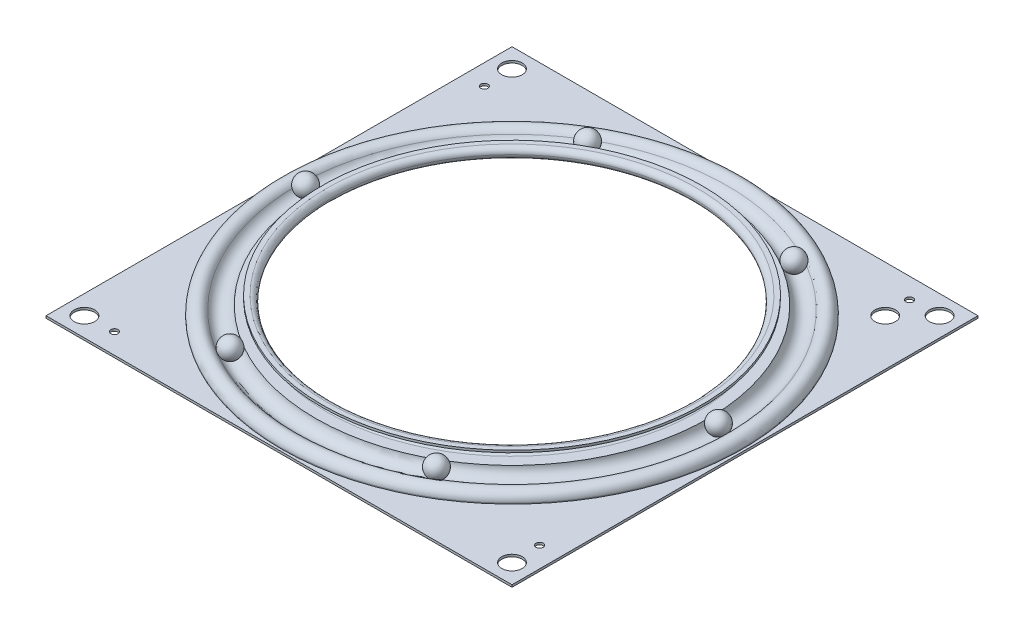
ISO-10303-21;
HEADER;
FILE_DESCRIPTION(('STEP AP214'),'2;1');
FILE_NAME('part.step','',(''),(''),'','','');
FILE_SCHEMA(('AUTOMOTIVE_DESIGN { 1 0 10303 214 1 1 1 1 }'));
ENDSEC;
DATA;
#1=APPLICATION_CONTEXT('core data for automotive mechanical design processes');
#2=APPLICATION_PROTOCOL_DEFINITION('international standard','automotive_design',2000,#1);
#3=PRODUCT_CONTEXT('',#1,'mechanical');
#4=PRODUCT('Part','Part','',(#3));
#5=PRODUCT_RELATED_PRODUCT_CATEGORY('part','',(#4));
#6=PRODUCT_DEFINITION_FORMATION('','',#4);
#7=PRODUCT_DEFINITION_CONTEXT('part definition',#1,'design');
#8=PRODUCT_DEFINITION('design','',#6,#7);
#9=PRODUCT_DEFINITION_SHAPE('','',#8);
#10=(LENGTH_UNIT() NAMED_UNIT(*) SI_UNIT(.MILLI.,.METRE.));
#11=(NAMED_UNIT(*) PLANE_ANGLE_UNIT() SI_UNIT($,.RADIAN.));
#12=(NAMED_UNIT(*) SI_UNIT($,.STERADIAN.) SOLID_ANGLE_UNIT());
#13=UNCERTAINTY_MEASURE_WITH_UNIT(LENGTH_MEASURE(1.E-05),#10,'distance_accuracy_value','');
#14=(GEOMETRIC_REPRESENTATION_CONTEXT(3) GLOBAL_UNCERTAINTY_ASSIGNED_CONTEXT((#13)) GLOBAL_UNIT_ASSIGNED_CONTEXT((#10,
#11,#12)) REPRESENTATION_CONTEXT('',''));
#15=CARTESIAN_POINT('',(0.,0.,0.));
#16=DIRECTION('',(0.,0.,1.));
#17=DIRECTION('',(1.,0.,0.));
#18=AXIS2_PLACEMENT_3D('',#15,#16,#17);
#19=CARTESIAN_POINT('',(34.1090250000007,-0.761999999999995,-59.0785642966366));
#20=DIRECTION('',(0.,1.,0.));
#21=DIRECTION('',(0.50000000000001,0.,-0.866025403784433));
#22=AXIS2_PLACEMENT_3D('',#19,#20,#21);
#23=SPHERICAL_SURFACE('',#22,3.27659999999999);
#24=CARTESIAN_POINT('',(34.1090250000007,2.5146,-59.0785642966366));
#25=VERTEX_POINT('',#24);
#26=VERTEX_LOOP('',#25);
#27=FACE_BOUND('',#26,.T.);
#28=ADVANCED_FACE('F40',(#27),#23,.T.);
#29=CLOSED_SHELL('',(#28));
#30=MANIFOLD_SOLID_BREP('B2',#29);
#31=CARTESIAN_POINT('',(-34.1090249999995,-0.761999999999995,-59.0785642966373));
#32=DIRECTION('',(0.,1.,0.));
#33=DIRECTION('',(-0.499999999999992,0.,-0.866025403784443));
#34=AXIS2_PLACEMENT_3D('',#31,#32,#33);
#35=SPHERICAL_SURFACE('',#34,3.27659999999999);
#36=CARTESIAN_POINT('',(-34.1090249999995,2.5146,-59.0785642966373));
#37=VERTEX_POINT('',#36);
#38=VERTEX_LOOP('',#37);
#39=FACE_BOUND('',#38,.T.);
#40=ADVANCED_FACE('F59',(#39),#35,.T.);
#41=CLOSED_SHELL('',(#40));
#42=MANIFOLD_SOLID_BREP('B6',#41);
#43=CARTESIAN_POINT('',(-68.21805,-0.761999999999995,-4.76364373004656E-13));
#44=DIRECTION('',(0.,1.,0.));
#45=DIRECTION('',(-1.,0.,0.));
#46=AXIS2_PLACEMENT_3D('',#43,#44,#45);
#47=SPHERICAL_SURFACE('',#46,3.27659999999999);
#48=CARTESIAN_POINT('',(-68.21805,2.5146,-4.76364373004656E-13));
#49=VERTEX_POINT('',#48);
#50=VERTEX_LOOP('',#49);
#51=FACE_BOUND('',#50,.T.);
#52=ADVANCED_FACE('F78',(#51),#47,.T.);
#53=CLOSED_SHELL('',(#52));
#54=MANIFOLD_SOLID_BREP('B36',#53);
#55=CARTESIAN_POINT('',(-34.1090250000003,-0.761999999999995,59.0785642966369));
#56=DIRECTION('',(0.,1.,0.));
#57=DIRECTION('',(-0.500000000000004,0.,0.866025403784436));
#58=AXIS2_PLACEMENT_3D('',#55,#56,#57);
#59=SPHERICAL_SURFACE('',#58,3.27659999999999);
#60=CARTESIAN_POINT('',(-34.1090250000003,2.5146,59.0785642966369));
#61=VERTEX_POINT('',#60);
#62=VERTEX_LOOP('',#61);
#63=FACE_BOUND('',#62,.T.);
#64=ADVANCED_FACE('F97',(#63),#59,.T.);
#65=CLOSED_SHELL('',(#64));
#66=MANIFOLD_SOLID_BREP('B55',#65);
#67=CARTESIAN_POINT('',(34.1090249999999,-0.761999999999995,59.0785642966371));
#68=DIRECTION('',(0.,1.,0.));
#69=DIRECTION('',(0.499999999999998,0.,0.86602540378444));
#70=AXIS2_PLACEMENT_3D('',#67,#68,#69);
#71=SPHERICAL_SURFACE('',#70,3.27659999999999);
#72=CARTESIAN_POINT('',(34.1090249999999,2.5146,59.0785642966371));
#73=VERTEX_POINT('',#72);
#74=VERTEX_LOOP('',#73);
#75=FACE_BOUND('',#74,.T.);
#76=ADVANCED_FACE('F116',(#75),#71,.T.);
#77=CLOSED_SHELL('',(#76));
#78=MANIFOLD_SOLID_BREP('B74',#77);
#79=CARTESIAN_POINT('',(68.21805,-0.761999999999995,0.));
#80=DIRECTION('',(0.,1.,0.));
#81=DIRECTION('',(1.,0.,0.));
#82=AXIS2_PLACEMENT_3D('',#79,#80,#81);
#83=SPHERICAL_SURFACE('',#82,3.27659999999999);
#84=CARTESIAN_POINT('',(68.21805,2.5146,0.));
#85=VERTEX_POINT('',#84);
#86=VERTEX_LOOP('',#85);
#87=FACE_BOUND('',#86,.T.);
#88=ADVANCED_FACE('F138',(#87),#83,.T.);
#89=CLOSED_SHELL('',(#88));
#90=MANIFOLD_SOLID_BREP('B93',#89);
#91=CARTESIAN_POINT('',(0.,0.,0.));
#92=DIRECTION('',(0.,1.,0.));
#93=DIRECTION('',(0.,0.,1.));
#94=AXIS2_PLACEMENT_3D('',#91,#92,#93);
#95=TOROIDAL_SURFACE('',#94,61.214,1.778);
#96=CARTESIAN_POINT('',(0.,-1.77799999999999,0.));
#97=DIRECTION('',(0.,1.,0.));
#98=DIRECTION('',(0.,0.,1.));
#99=AXIS2_PLACEMENT_3D('',#96,#97,#98);
#100=CIRCLE('',#99,61.214);
#101=CARTESIAN_POINT('',(0.,-1.77799999999999,61.214));
#102=VERTEX_POINT('',#101);
#103=EDGE_CURVE('E233',#102,#102,#100,.T.);
#104=ORIENTED_EDGE('',*,*,#103,.F.);
#105=EDGE_LOOP('',(#104));
#106=FACE_BOUND('',#105,.T.);
#107=CARTESIAN_POINT('',(0.,0.,0.));
#108=DIRECTION('',(0.,1.,0.));
#109=DIRECTION('',(0.,0.,1.));
#110=AXIS2_PLACEMENT_3D('',#107,#108,#109);
#111=CIRCLE('',#110,59.436);
#112=CARTESIAN_POINT('',(0.,0.,59.436));
#113=VERTEX_POINT('',#112);
#114=EDGE_CURVE('E136',#113,#113,#111,.T.);
#115=ORIENTED_EDGE('',*,*,#114,.T.);
#116=EDGE_LOOP('',(#115));
#117=FACE_BOUND('',#116,.T.);
#118=ADVANCED_FACE('F151',(#106,#117),#95,.T.);
#119=CARTESIAN_POINT('',(75.5293408614699,-4.82599999999999,0.));
#120=DIRECTION('',(0.,1.,0.));
#121=DIRECTION('',(0.,0.,1.));
#122=AXIS2_PLACEMENT_3D('',#119,#120,#121);
#123=PLANE('',#122);
#124=CARTESIAN_POINT('',(61.669843878931,-4.826,-61.6698438789307));
#125=DIRECTION('',(0.,1.,0.));
#126=DIRECTION('',(0.,0.,1.));
#127=AXIS2_PLACEMENT_3D('',#124,#125,#126);
#128=CIRCLE('',#127,3.3782);
#129=CARTESIAN_POINT('',(61.669843878931,-4.826,-58.2916438789307));
#130=VERTEX_POINT('',#129);
#131=EDGE_CURVE('E558',#130,#130,#128,.T.);
#132=ORIENTED_EDGE('',*,*,#131,.T.);
#133=EDGE_LOOP('',(#132));
#134=FACE_BOUND('',#133,.T.);
#135=CARTESIAN_POINT('',(-61.1251000000008,-4.82599999999999,70.2436999999994));
#136=DIRECTION('',(0.,1.,0.));
#137=DIRECTION('',(0.,0.,1.));
#138=AXIS2_PLACEMENT_3D('',#135,#136,#137);
#139=CIRCLE('',#138,1.19062499999999);
#140=CARTESIAN_POINT('',(-61.1251000000008,-4.82599999999999,71.4343249999993));
#141=VERTEX_POINT('',#140);
#142=EDGE_CURVE('E567',#141,#141,#139,.T.);
#143=ORIENTED_EDGE('',*,*,#142,.T.);
#144=EDGE_LOOP('',(#143));
#145=FACE_BOUND('',#144,.T.);
#146=CARTESIAN_POINT('',(70.2436999999996,-4.82599999999999,61.1251000000005));
#147=DIRECTION('',(0.,1.,0.));
#148=DIRECTION('',(0.,0.,1.));
#149=AXIS2_PLACEMENT_3D('',#146,#147,#148);
#150=CIRCLE('',#149,1.19062499999999);
#151=CARTESIAN_POINT('',(70.2436999999996,-4.82599999999999,62.3157250000005));
#152=VERTEX_POINT('',#151);
#153=EDGE_CURVE('E573',#152,#152,#150,.T.);
#154=ORIENTED_EDGE('',*,*,#153,.T.);
#155=EDGE_LOOP('',(#154));
#156=FACE_BOUND('',#155,.T.);
#157=CARTESIAN_POINT('',(61.1251000000003,-4.82599999999999,-70.2436999999998));
#158=DIRECTION('',(0.,1.,0.));
#159=DIRECTION('',(0.,0.,1.));
#160=AXIS2_PLACEMENT_3D('',#157,#158,#159);
#161=CIRCLE('',#160,1.19062499999999);
#162=CARTESIAN_POINT('',(61.1251000000003,-4.82599999999999,-69.0530749999998));
#163=VERTEX_POINT('',#162);
#164=EDGE_CURVE('E579',#163,#163,#161,.T.);
#165=ORIENTED_EDGE('',*,*,#164,.T.);
#166=EDGE_LOOP('',(#165));
#167=FACE_BOUND('',#166,.T.);
#168=CARTESIAN_POINT('',(-70.2437,-4.82599999999999,-61.1251));
#169=DIRECTION('',(0.,1.,0.));
#170=DIRECTION('',(0.,0.,1.));
#171=AXIS2_PLACEMENT_3D('',#168,#169,#170);
#172=CIRCLE('',#171,1.19062499999999);
#173=CARTESIAN_POINT('',(-70.2437,-4.82599999999999,-59.934475));
#174=VERTEX_POINT('',#173);
#175=EDGE_CURVE('E585',#174,#174,#172,.T.);
#176=ORIENTED_EDGE('',*,*,#175,.T.);
#177=EDGE_LOOP('',(#176));
#178=FACE_BOUND('',#177,.T.);
#179=CARTESIAN_POINT('',(70.6501,-4.826,-70.6501));
#180=DIRECTION('',(0.,1.,0.));
#181=DIRECTION('',(0.,0.,1.));
#182=AXIS2_PLACEMENT_3D('',#179,#180,#181);
#183=CIRCLE('',#182,3.3782);
#184=CARTESIAN_POINT('',(70.6501,-4.826,-67.2719));
#185=VERTEX_POINT('',#184);
#186=EDGE_CURVE('E588',#185,#185,#183,.T.);
#187=ORIENTED_EDGE('',*,*,#186,.T.);
#188=EDGE_LOOP('',(#187));
#189=FACE_BOUND('',#188,.T.);
#190=CARTESIAN_POINT('',(70.6501,-4.826,70.6501));
#191=DIRECTION('',(0.,1.,0.));
#192=DIRECTION('',(0.,0.,1.));
#193=AXIS2_PLACEMENT_3D('',#190,#191,#192);
#194=CIRCLE('',#193,3.3782);
#195=CARTESIAN_POINT('',(70.6501,-4.826,74.0283));
#196=VERTEX_POINT('',#195);
#197=EDGE_CURVE('E594',#196,#196,#194,.T.);
#198=ORIENTED_EDGE('',*,*,#197,.T.);
#199=EDGE_LOOP('',(#198));
#200=FACE_BOUND('',#199,.T.);
#201=CARTESIAN_POINT('',(-70.6501,-4.826,-70.6501));
#202=DIRECTION('',(0.,1.,0.));
#203=DIRECTION('',(0.,0.,1.));
#204=AXIS2_PLACEMENT_3D('',#201,#202,#203);
#205=CIRCLE('',#204,3.3782);
#206=CARTESIAN_POINT('',(-70.6501,-4.826,-67.2719));
#207=VERTEX_POINT('',#206);
#208=EDGE_CURVE('E600',#207,#207,#205,.T.);
#209=ORIENTED_EDGE('',*,*,#208,.T.);
#210=EDGE_LOOP('',(#209));
#211=FACE_BOUND('',#210,.T.);
#212=CARTESIAN_POINT('',(-70.6501,-4.826,70.6501));
#213=DIRECTION('',(0.,1.,0.));
#214=DIRECTION('',(0.,0.,1.));
#215=AXIS2_PLACEMENT_3D('',#212,#213,#214);
#216=CIRCLE('',#215,3.3782);
#217=CARTESIAN_POINT('',(-70.6501,-4.826,74.0283));
#218=VERTEX_POINT('',#217);
#219=EDGE_CURVE('E606',#218,#218,#216,.T.);
#220=ORIENTED_EDGE('',*,*,#219,.T.);
#221=EDGE_LOOP('',(#220));
#222=FACE_BOUND('',#221,.T.);
#223=DIRECTION('',(1.,0.,0.));
#224=VECTOR('',#223,1.);
#225=CARTESIAN_POINT('',(77.0001,-4.82599999999999,-77.0001));
#226=LINE('',#225,#224);
#227=CARTESIAN_POINT('',(-77.0001,-4.82599999999999,-77.0001));
#228=VERTEX_POINT('',#227);
#229=CARTESIAN_POINT('',(77.0001,-4.82599999999999,-77.0001));
#230=VERTEX_POINT('',#229);
#231=EDGE_CURVE('E211',#228,#230,#226,.T.);
#232=ORIENTED_EDGE('',*,*,#231,.T.);
#233=DIRECTION('',(0.,0.,1.));
#234=VECTOR('',#233,1.);
#235=CARTESIAN_POINT('',(77.0001,-4.82599999999999,77.0001));
#236=LINE('',#235,#234);
#237=CARTESIAN_POINT('',(77.0001,-4.82599999999999,77.0001));
#238=VERTEX_POINT('',#237);
#239=EDGE_CURVE('E615',#230,#238,#236,.T.);
#240=ORIENTED_EDGE('',*,*,#239,.T.);
#241=DIRECTION('',(-1.,0.,0.));
#242=VECTOR('',#241,1.);
#243=CARTESIAN_POINT('',(77.0001,-4.82599999999999,77.0001));
#244=LINE('',#243,#242);
#245=CARTESIAN_POINT('',(-77.0001,-4.82599999999999,77.0001));
#246=VERTEX_POINT('',#245);
#247=EDGE_CURVE('E612',#238,#246,#244,.T.);
#248=ORIENTED_EDGE('',*,*,#247,.T.);
#249=DIRECTION('',(0.,0.,-1.));
#250=VECTOR('',#249,1.);
#251=CARTESIAN_POINT('',(-77.0001,-4.82599999999999,77.0001));
#252=LINE('',#251,#250);
#253=EDGE_CURVE('E224',#246,#228,#252,.T.);
#254=ORIENTED_EDGE('',*,*,#253,.T.);
#255=EDGE_LOOP('',(#232,#240,#248,#254));
#256=FACE_BOUND('',#255,.T.);
#257=CARTESIAN_POINT('',(0.,-4.82599999999999,0.));
#258=DIRECTION('',(0.,1.,0.));
#259=DIRECTION('',(0.,0.,1.));
#260=AXIS2_PLACEMENT_3D('',#257,#258,#259);
#261=CIRCLE('',#260,75.5293408614699);
#262=CARTESIAN_POINT('',(0.,-4.82599999999999,75.5293408614699));
#263=VERTEX_POINT('',#262);
#264=EDGE_CURVE('E220',#263,#263,#261,.T.);
#265=ORIENTED_EDGE('',*,*,#264,.T.);
#266=EDGE_LOOP('',(#265));
#267=FACE_BOUND('',#266,.T.);
#268=ADVANCED_FACE('F153',(#134,#145,#156,#167,#178,#189,#200,#211,#222,#256,#267),#123,.F.);
#269=CARTESIAN_POINT('',(75.5293408614699,-4.0894,0.));
#270=DIRECTION('',(0.,1.,0.));
#271=DIRECTION('',(0.,0.,1.));
#272=AXIS2_PLACEMENT_3D('',#269,#270,#271);
#273=PLANE('',#272);
#274=CARTESIAN_POINT('',(61.669843878931,-4.0894,-61.6698438789307));
#275=DIRECTION('',(0.,1.,0.));
#276=DIRECTION('',(0.,0.,1.));
#277=AXIS2_PLACEMENT_3D('',#274,#275,#276);
#278=CIRCLE('',#277,3.3782);
#279=CARTESIAN_POINT('',(61.669843878931,-4.0894,-58.2916438789307));
#280=VERTEX_POINT('',#279);
#281=EDGE_CURVE('E560',#280,#280,#278,.T.);
#282=ORIENTED_EDGE('',*,*,#281,.F.);
#283=EDGE_LOOP('',(#282));
#284=FACE_BOUND('',#283,.T.);
#285=CARTESIAN_POINT('',(-61.1251000000008,-4.08939999999999,70.2436999999994));
#286=DIRECTION('',(0.,1.,0.));
#287=DIRECTION('',(0.,0.,1.));
#288=AXIS2_PLACEMENT_3D('',#285,#286,#287);
#289=CIRCLE('',#288,1.19062499999999);
#290=CARTESIAN_POINT('',(-61.1251000000008,-4.08939999999999,71.4343249999993));
#291=VERTEX_POINT('',#290);
#292=EDGE_CURVE('E562',#291,#291,#289,.T.);
#293=ORIENTED_EDGE('',*,*,#292,.F.);
#294=EDGE_LOOP('',(#293));
#295=FACE_BOUND('',#294,.T.);
#296=CARTESIAN_POINT('',(70.2436999999996,-4.08939999999999,61.1251000000005));
#297=DIRECTION('',(0.,1.,0.));
#298=DIRECTION('',(0.,0.,1.));
#299=AXIS2_PLACEMENT_3D('',#296,#297,#298);
#300=CIRCLE('',#299,1.19062499999999);
#301=CARTESIAN_POINT('',(70.2436999999996,-4.08939999999999,62.3157250000005));
#302=VERTEX_POINT('',#301);
#303=EDGE_CURVE('E570',#302,#302,#300,.T.);
#304=ORIENTED_EDGE('',*,*,#303,.F.);
#305=EDGE_LOOP('',(#304));
#306=FACE_BOUND('',#305,.T.);
#307=CARTESIAN_POINT('',(61.1251000000003,-4.08939999999999,-70.2436999999998));
#308=DIRECTION('',(0.,1.,0.));
#309=DIRECTION('',(0.,0.,1.));
#310=AXIS2_PLACEMENT_3D('',#307,#308,#309);
#311=CIRCLE('',#310,1.19062499999999);
#312=CARTESIAN_POINT('',(61.1251000000003,-4.08939999999999,-69.0530749999998));
#313=VERTEX_POINT('',#312);
#314=EDGE_CURVE('E576',#313,#313,#311,.T.);
#315=ORIENTED_EDGE('',*,*,#314,.F.);
#316=EDGE_LOOP('',(#315));
#317=FACE_BOUND('',#316,.T.);
#318=CARTESIAN_POINT('',(-70.2437,-4.08939999999999,-61.1251));
#319=DIRECTION('',(0.,1.,0.));
#320=DIRECTION('',(0.,0.,1.));
#321=AXIS2_PLACEMENT_3D('',#318,#319,#320);
#322=CIRCLE('',#321,1.19062499999999);
#323=CARTESIAN_POINT('',(-70.2437,-4.08939999999999,-59.934475));
#324=VERTEX_POINT('',#323);
#325=EDGE_CURVE('E582',#324,#324,#322,.T.);
#326=ORIENTED_EDGE('',*,*,#325,.F.);
#327=EDGE_LOOP('',(#326));
#328=FACE_BOUND('',#327,.T.);
#329=CARTESIAN_POINT('',(70.6501,-4.0894,-70.6501));
#330=DIRECTION('',(0.,1.,0.));
#331=DIRECTION('',(0.,0.,1.));
#332=AXIS2_PLACEMENT_3D('',#329,#330,#331);
#333=CIRCLE('',#332,3.3782);
#334=CARTESIAN_POINT('',(70.6501,-4.0894,-67.2719));
#335=VERTEX_POINT('',#334);
#336=EDGE_CURVE('E591',#335,#335,#333,.T.);
#337=ORIENTED_EDGE('',*,*,#336,.F.);
#338=EDGE_LOOP('',(#337));
#339=FACE_BOUND('',#338,.T.);
#340=CARTESIAN_POINT('',(70.6501,-4.0894,70.6501));
#341=DIRECTION('',(0.,1.,0.));
#342=DIRECTION('',(0.,0.,1.));
#343=AXIS2_PLACEMENT_3D('',#340,#341,#342);
#344=CIRCLE('',#343,3.3782);
#345=CARTESIAN_POINT('',(70.6501,-4.0894,74.0283));
#346=VERTEX_POINT('',#345);
#347=EDGE_CURVE('E597',#346,#346,#344,.T.);
#348=ORIENTED_EDGE('',*,*,#347,.F.);
#349=EDGE_LOOP('',(#348));
#350=FACE_BOUND('',#349,.T.);
#351=CARTESIAN_POINT('',(-70.6501,-4.0894,-70.6501));
#352=DIRECTION('',(0.,1.,0.));
#353=DIRECTION('',(0.,0.,1.));
#354=AXIS2_PLACEMENT_3D('',#351,#352,#353);
#355=CIRCLE('',#354,3.3782);
#356=CARTESIAN_POINT('',(-70.6501,-4.0894,-67.2719));
#357=VERTEX_POINT('',#356);
#358=EDGE_CURVE('E603',#357,#357,#355,.T.);
#359=ORIENTED_EDGE('',*,*,#358,.F.);
#360=EDGE_LOOP('',(#359));
#361=FACE_BOUND('',#360,.T.);
#362=CARTESIAN_POINT('',(-70.6501,-4.0894,70.6501));
#363=DIRECTION('',(0.,1.,0.));
#364=DIRECTION('',(0.,0.,1.));
#365=AXIS2_PLACEMENT_3D('',#362,#363,#364);
#366=CIRCLE('',#365,3.3782);
#367=CARTESIAN_POINT('',(-70.6501,-4.0894,74.0283));
#368=VERTEX_POINT('',#367);
#369=EDGE_CURVE('E198',#368,#368,#366,.T.);
#370=ORIENTED_EDGE('',*,*,#369,.F.);
#371=EDGE_LOOP('',(#370));
#372=FACE_BOUND('',#371,.T.);
#373=DIRECTION('',(0.,0.,-1.));
#374=VECTOR('',#373,1.);
#375=CARTESIAN_POINT('',(-77.0001,-4.0894,77.0001));
#376=LINE('',#375,#374);
#377=CARTESIAN_POINT('',(-77.0001,-4.0894,77.0001));
#378=VERTEX_POINT('',#377);
#379=CARTESIAN_POINT('',(-77.0001,-4.0894,-77.0001));
#380=VERTEX_POINT('',#379);
#381=EDGE_CURVE('E192',#378,#380,#376,.T.);
#382=ORIENTED_EDGE('',*,*,#381,.F.);
#383=DIRECTION('',(-1.,0.,0.));
#384=VECTOR('',#383,1.);
#385=CARTESIAN_POINT('',(77.0001,-4.0894,77.0001));
#386=LINE('',#385,#384);
#387=CARTESIAN_POINT('',(77.0001,-4.0894,77.0001));
#388=VERTEX_POINT('',#387);
#389=EDGE_CURVE('E173',#388,#378,#386,.T.);
#390=ORIENTED_EDGE('',*,*,#389,.F.);
#391=DIRECTION('',(0.,0.,1.));
#392=VECTOR('',#391,1.);
#393=CARTESIAN_POINT('',(77.0001,-4.0894,77.0001));
#394=LINE('',#393,#392);
#395=CARTESIAN_POINT('',(77.0001,-4.0894,-77.0001));
#396=VERTEX_POINT('',#395);
#397=EDGE_CURVE('E167',#396,#388,#394,.T.);
#398=ORIENTED_EDGE('',*,*,#397,.F.);
#399=DIRECTION('',(1.,0.,0.));
#400=VECTOR('',#399,1.);
#401=CARTESIAN_POINT('',(77.0001,-4.0894,-77.0001));
#402=LINE('',#401,#400);
#403=EDGE_CURVE('E188',#380,#396,#402,.T.);
#404=ORIENTED_EDGE('',*,*,#403,.F.);
#405=EDGE_LOOP('',(#382,#390,#398,#404));
#406=FACE_BOUND('',#405,.T.);
#407=CARTESIAN_POINT('',(0.,-4.08939999999999,0.));
#408=DIRECTION('',(0.,1.,0.));
#409=DIRECTION('',(0.,0.,1.));
#410=AXIS2_PLACEMENT_3D('',#407,#408,#409);
#411=CIRCLE('',#410,76.26594086147);
#412=CARTESIAN_POINT('',(0.,-4.08939999999999,76.26594086147));
#413=VERTEX_POINT('',#412);
#414=EDGE_CURVE('E160',#413,#413,#411,.T.);
#415=ORIENTED_EDGE('',*,*,#414,.F.);
#416=EDGE_LOOP('',(#415));
#417=FACE_BOUND('',#416,.T.);
#418=ADVANCED_FACE('F190',(#284,#295,#306,#317,#328,#339,#350,#361,#372,#406,#417),#273,.T.);
#419=CARTESIAN_POINT('',(0.,21.7127262600922,0.));
#420=DIRECTION('',(0.,1.,0.));
#421=DIRECTION('',(0.,0.,1.));
#422=AXIS2_PLACEMENT_3D('',#419,#420,#421);
#423=CYLINDRICAL_SURFACE('',#422,76.26594086147);
#424=ORIENTED_EDGE('',*,*,#414,.T.);
#425=EDGE_LOOP('',(#424));
#426=FACE_BOUND('',#425,.T.);
#427=CARTESIAN_POINT('',(0.,-3.81,0.));
#428=DIRECTION('',(0.,1.,0.));
#429=DIRECTION('',(0.,0.,1.));
#430=AXIS2_PLACEMENT_3D('',#427,#428,#429);
#431=CIRCLE('',#430,76.26594086147);
#432=CARTESIAN_POINT('',(0.,-3.81,76.26594086147));
#433=VERTEX_POINT('',#432);
#434=EDGE_CURVE('E257',#433,#433,#431,.T.);
#435=ORIENTED_EDGE('',*,*,#434,.F.);
#436=EDGE_LOOP('',(#435));
#437=FACE_BOUND('',#436,.T.);
#438=ADVANCED_FACE('F262',(#426,#437),#423,.T.);
#439=CARTESIAN_POINT('',(0.,-3.81,0.));
#440=DIRECTION('',(0.,1.,0.));
#441=DIRECTION('',(0.,0.,1.));
#442=AXIS2_PLACEMENT_3D('',#439,#440,#441);
#443=TOROIDAL_SURFACE('',#442,73.49734086147,2.76860000000001);
#444=ORIENTED_EDGE('',*,*,#434,.T.);
#445=EDGE_LOOP('',(#444));
#446=FACE_BOUND('',#445,.T.);
#447=CARTESIAN_POINT('',(0.,-2.4257,0.));
#448=DIRECTION('',(0.,1.,0.));
#449=DIRECTION('',(0.,0.,1.));
#450=AXIS2_PLACEMENT_3D('',#447,#448,#449);
#451=CIRCLE('',#450,71.0996629285523);
#452=CARTESIAN_POINT('',(0.,-2.4257,71.0996629285523));
#453=VERTEX_POINT('',#452);
#454=EDGE_CURVE('E254',#453,#453,#451,.T.);
#455=ORIENTED_EDGE('',*,*,#454,.F.);
#456=EDGE_LOOP('',(#455));
#457=FACE_BOUND('',#456,.T.);
#458=ADVANCED_FACE('F270',(#446,#457),#443,.T.);
#459=CARTESIAN_POINT('',(0.,-0.761999999999995,0.));
#460=DIRECTION('',(0.,1.,0.));
#461=DIRECTION('',(0.,0.,1.));
#462=AXIS2_PLACEMENT_3D('',#459,#460,#461);
#463=TOROIDAL_SURFACE('',#462,68.21805,3.32739999999999);
#464=ORIENTED_EDGE('',*,*,#454,.T.);
#465=EDGE_LOOP('',(#464));
#466=FACE_BOUND('',#465,.T.);
#467=CARTESIAN_POINT('',(0.,-1.0414,0.));
#468=DIRECTION('',(0.,1.,0.));
#469=DIRECTION('',(0.,0.,1.));
#470=AXIS2_PLACEMENT_3D('',#467,#468,#469);
#471=CIRCLE('',#470,64.9024012851932);
#472=CARTESIAN_POINT('',(0.,-1.0414,64.9024012851932));
#473=VERTEX_POINT('',#472);
#474=EDGE_CURVE('E251',#473,#473,#471,.T.);
#475=ORIENTED_EDGE('',*,*,#474,.F.);
#476=EDGE_LOOP('',(#475));
#477=FACE_BOUND('',#476,.T.);
#478=ADVANCED_FACE('F320',(#466,#477),#463,.F.);
#479=CARTESIAN_POINT('',(61.214,-1.0414,0.));
#480=DIRECTION('',(0.,1.,0.));
#481=DIRECTION('',(0.,0.,1.));
#482=AXIS2_PLACEMENT_3D('',#479,#480,#481);
#483=PLANE('',#482);
#484=ORIENTED_EDGE('',*,*,#474,.T.);
#485=EDGE_LOOP('',(#484));
#486=FACE_BOUND('',#485,.T.);
#487=CARTESIAN_POINT('',(0.,-1.0414,0.));
#488=DIRECTION('',(0.,1.,0.));
#489=DIRECTION('',(0.,0.,1.));
#490=AXIS2_PLACEMENT_3D('',#487,#488,#489);
#491=CIRCLE('',#490,61.214);
#492=CARTESIAN_POINT('',(0.,-1.0414,61.214));
#493=VERTEX_POINT('',#492);
#494=EDGE_CURVE('E248',#493,#493,#491,.T.);
#495=ORIENTED_EDGE('',*,*,#494,.F.);
#496=EDGE_LOOP('',(#495));
#497=FACE_BOUND('',#496,.T.);
#498=ADVANCED_FACE('F316',(#486,#497),#483,.T.);
#499=CARTESIAN_POINT('',(0.,0.,0.));
#500=DIRECTION('',(0.,1.,0.));
#501=DIRECTION('',(0.,0.,1.));
#502=AXIS2_PLACEMENT_3D('',#499,#500,#501);
#503=TOROIDAL_SURFACE('',#502,61.214,1.0414);
#504=ORIENTED_EDGE('',*,*,#494,.T.);
#505=EDGE_LOOP('',(#504));
#506=FACE_BOUND('',#505,.T.);
#507=CARTESIAN_POINT('',(0.,1.0414,0.));
#508=DIRECTION('',(0.,1.,0.));
#509=DIRECTION('',(0.,0.,1.));
#510=AXIS2_PLACEMENT_3D('',#507,#508,#509);
#511=CIRCLE('',#510,61.214);
#512=CARTESIAN_POINT('',(0.,1.0414,61.214));
#513=VERTEX_POINT('',#512);
#514=EDGE_CURVE('E245',#513,#513,#511,.T.);
#515=ORIENTED_EDGE('',*,*,#514,.F.);
#516=EDGE_LOOP('',(#515));
#517=FACE_BOUND('',#516,.T.);
#518=ADVANCED_FACE('F310',(#506,#517),#503,.F.);
#519=CARTESIAN_POINT('',(62.7485494601266,1.0414,0.));
#520=DIRECTION('',(0.,-1.,0.));
#521=DIRECTION('',(0.,0.,-1.));
#522=AXIS2_PLACEMENT_3D('',#519,#520,#521);
#523=PLANE('',#522);
#524=ORIENTED_EDGE('',*,*,#514,.T.);
#525=EDGE_LOOP('',(#524));
#526=FACE_BOUND('',#525,.T.);
#527=CARTESIAN_POINT('',(0.,1.0414,0.));
#528=DIRECTION('',(0.,1.,0.));
#529=DIRECTION('',(0.,0.,1.));
#530=AXIS2_PLACEMENT_3D('',#527,#528,#529);
#531=CIRCLE('',#530,62.7485494601266);
#532=CARTESIAN_POINT('',(0.,1.0414,62.7485494601266));
#533=VERTEX_POINT('',#532);
#534=EDGE_CURVE('E242',#533,#533,#531,.T.);
#535=ORIENTED_EDGE('',*,*,#534,.F.);
#536=EDGE_LOOP('',(#535));
#537=FACE_BOUND('',#536,.T.);
#538=ADVANCED_FACE('F304',(#526,#537),#523,.T.);
#539=CARTESIAN_POINT('',(0.,21.7127262600922,0.));
#540=DIRECTION('',(0.,1.,0.));
#541=DIRECTION('',(0.,0.,1.));
#542=AXIS2_PLACEMENT_3D('',#539,#540,#541);
#543=CYLINDRICAL_SURFACE('',#542,62.7485494601266);
#544=ORIENTED_EDGE('',*,*,#534,.T.);
#545=EDGE_LOOP('',(#544));
#546=FACE_BOUND('',#545,.T.);
#547=CARTESIAN_POINT('',(0.,1.778,0.));
#548=DIRECTION('',(0.,1.,0.));
#549=DIRECTION('',(0.,0.,1.));
#550=AXIS2_PLACEMENT_3D('',#547,#548,#549);
#551=CIRCLE('',#550,62.7485494601266);
#552=CARTESIAN_POINT('',(0.,1.778,62.7485494601266));
#553=VERTEX_POINT('',#552);
#554=EDGE_CURVE('E239',#553,#553,#551,.T.);
#555=ORIENTED_EDGE('',*,*,#554,.F.);
#556=EDGE_LOOP('',(#555));
#557=FACE_BOUND('',#556,.T.);
#558=ADVANCED_FACE('F295',(#546,#557),#543,.T.);
#559=CARTESIAN_POINT('',(62.7485494601266,1.778,0.));
#560=DIRECTION('',(0.,-1.,0.));
#561=DIRECTION('',(0.,0.,-1.));
#562=AXIS2_PLACEMENT_3D('',#559,#560,#561);
#563=PLANE('',#562);
#564=CARTESIAN_POINT('',(0.,1.778,0.));
#565=DIRECTION('',(0.,1.,0.));
#566=DIRECTION('',(0.,0.,1.));
#567=AXIS2_PLACEMENT_3D('',#564,#565,#566);
#568=CIRCLE('',#567,61.214);
#569=CARTESIAN_POINT('',(0.,1.778,61.214));
#570=VERTEX_POINT('',#569);
#571=EDGE_CURVE('E236',#570,#570,#568,.T.);
#572=ORIENTED_EDGE('',*,*,#571,.F.);
#573=EDGE_LOOP('',(#572));
#574=FACE_BOUND('',#573,.T.);
#575=ORIENTED_EDGE('',*,*,#554,.T.);
#576=EDGE_LOOP('',(#575));
#577=FACE_BOUND('',#576,.T.);
#578=ADVANCED_FACE('F287',(#574,#577),#563,.F.);
#579=ORIENTED_EDGE('',*,*,#114,.F.);
#580=EDGE_LOOP('',(#579));
#581=FACE_BOUND('',#580,.T.);
#582=ORIENTED_EDGE('',*,*,#571,.T.);
#583=EDGE_LOOP('',(#582));
#584=FACE_BOUND('',#583,.T.);
#585=ADVANCED_FACE('F278',(#581,#584),#95,.T.);
#586=CARTESIAN_POINT('',(61.214,-1.778,0.));
#587=DIRECTION('',(0.,1.,0.));
#588=DIRECTION('',(0.,0.,1.));
#589=AXIS2_PLACEMENT_3D('',#586,#587,#588);
#590=PLANE('',#589);
#591=CARTESIAN_POINT('',(0.,-1.778,0.));
#592=DIRECTION('',(0.,1.,0.));
#593=DIRECTION('',(0.,0.,1.));
#594=AXIS2_PLACEMENT_3D('',#591,#592,#593);
#595=CIRCLE('',#594,64.2830989202533);
#596=CARTESIAN_POINT('',(0.,-1.778,64.2830989202533));
#597=VERTEX_POINT('',#596);
#598=EDGE_CURVE('E230',#597,#597,#595,.T.);
#599=ORIENTED_EDGE('',*,*,#598,.F.);
#600=EDGE_LOOP('',(#599));
#601=FACE_BOUND('',#600,.T.);
#602=ORIENTED_EDGE('',*,*,#103,.T.);
#603=EDGE_LOOP('',(#602));
#604=FACE_BOUND('',#603,.T.);
#605=ADVANCED_FACE('F286',(#601,#604),#590,.F.);
#606=CARTESIAN_POINT('',(0.,-0.761999999999995,0.));
#607=DIRECTION('',(0.,1.,0.));
#608=DIRECTION('',(0.,0.,1.));
#609=AXIS2_PLACEMENT_3D('',#606,#607,#608);
#610=TOROIDAL_SURFACE('',#609,68.21805,4.06399999999999);
#611=CARTESIAN_POINT('',(0.,-2.79399999999999,0.));
#612=DIRECTION('',(0.,1.,0.));
#613=DIRECTION('',(0.,0.,1.));
#614=AXIS2_PLACEMENT_3D('',#611,#612,#613);
#615=CIRCLE('',#614,71.73757724098);
#616=CARTESIAN_POINT('',(0.,-2.79399999999999,71.73757724098));
#617=VERTEX_POINT('',#616);
#618=EDGE_CURVE('E227',#617,#617,#615,.T.);
#619=ORIENTED_EDGE('',*,*,#618,.F.);
#620=EDGE_LOOP('',(#619));
#621=FACE_BOUND('',#620,.T.);
#622=ORIENTED_EDGE('',*,*,#598,.T.);
#623=EDGE_LOOP('',(#622));
#624=FACE_BOUND('',#623,.T.);
#625=ADVANCED_FACE('F293',(#621,#624),#610,.T.);
#626=CARTESIAN_POINT('',(0.,-3.81,0.));
#627=DIRECTION('',(0.,1.,0.));
#628=DIRECTION('',(0.,0.,1.));
#629=AXIS2_PLACEMENT_3D('',#626,#627,#628);
#630=TOROIDAL_SURFACE('',#629,73.49734086147,2.03200000000001);
#631=CARTESIAN_POINT('',(0.,-3.81,0.));
#632=DIRECTION('',(0.,1.,0.));
#633=DIRECTION('',(0.,0.,1.));
#634=AXIS2_PLACEMENT_3D('',#631,#632,#633);
#635=CIRCLE('',#634,75.5293408614699);
#636=CARTESIAN_POINT('',(0.,-3.81,75.5293408614699));
#637=VERTEX_POINT('',#636);
#638=EDGE_CURVE('E223',#637,#637,#635,.T.);
#639=ORIENTED_EDGE('',*,*,#638,.F.);
#640=EDGE_LOOP('',(#639));
#641=FACE_BOUND('',#640,.T.);
#642=ORIENTED_EDGE('',*,*,#618,.T.);
#643=EDGE_LOOP('',(#642));
#644=FACE_BOUND('',#643,.T.);
#645=ADVANCED_FACE('F383',(#641,#644),#630,.F.);
#646=CARTESIAN_POINT('',(0.,21.7127262600922,0.));
#647=DIRECTION('',(0.,1.,0.));
#648=DIRECTION('',(0.,0.,1.));
#649=AXIS2_PLACEMENT_3D('',#646,#647,#648);
#650=CYLINDRICAL_SURFACE('',#649,75.5293408614699);
#651=ORIENTED_EDGE('',*,*,#638,.T.);
#652=EDGE_LOOP('',(#651));
#653=FACE_BOUND('',#652,.T.);
#654=ORIENTED_EDGE('',*,*,#264,.F.);
#655=EDGE_LOOP('',(#654));
#656=FACE_BOUND('',#655,.T.);
#657=ADVANCED_FACE('F393',(#653,#656),#650,.F.);
#658=CARTESIAN_POINT('',(77.0001,213.699771448169,-77.0001));
#659=DIRECTION('',(0.,0.,-1.));
#660=DIRECTION('',(-1.,0.,0.));
#661=AXIS2_PLACEMENT_3D('',#658,#659,#660);
#662=PLANE('',#661);
#663=DIRECTION('',(0.,-1.,0.));
#664=VECTOR('',#663,1.);
#665=CARTESIAN_POINT('',(77.0001,213.699771448169,-77.0001));
#666=LINE('',#665,#664);
#667=EDGE_CURVE('E197',#396,#230,#666,.T.);
#668=ORIENTED_EDGE('',*,*,#667,.T.);
#669=ORIENTED_EDGE('',*,*,#231,.F.);
#670=DIRECTION('',(0.,-1.,0.));
#671=VECTOR('',#670,1.);
#672=CARTESIAN_POINT('',(-77.0001,213.699771448169,-77.0001));
#673=LINE('',#672,#671);
#674=EDGE_CURVE('E204',#380,#228,#673,.T.);
#675=ORIENTED_EDGE('',*,*,#674,.F.);
#676=ORIENTED_EDGE('',*,*,#403,.T.);
#677=EDGE_LOOP('',(#668,#669,#675,#676));
#678=FACE_BOUND('',#677,.T.);
#679=ADVANCED_FACE('F209',(#678),#662,.T.);
#680=CARTESIAN_POINT('',(-77.0001,213.699771448169,77.0001));
#681=DIRECTION('',(-1.,0.,0.));
#682=DIRECTION('',(0.,0.,1.));
#683=AXIS2_PLACEMENT_3D('',#680,#681,#682);
#684=PLANE('',#683);
#685=ORIENTED_EDGE('',*,*,#253,.F.);
#686=DIRECTION('',(0.,-1.,0.));
#687=VECTOR('',#686,1.);
#688=CARTESIAN_POINT('',(-77.0001,213.699771448169,77.0001));
#689=LINE('',#688,#687);
#690=EDGE_CURVE('E207',#378,#246,#689,.T.);
#691=ORIENTED_EDGE('',*,*,#690,.F.);
#692=ORIENTED_EDGE('',*,*,#381,.T.);
#693=ORIENTED_EDGE('',*,*,#674,.T.);
#694=EDGE_LOOP('',(#685,#691,#692,#693));
#695=FACE_BOUND('',#694,.T.);
#696=ADVANCED_FACE('F203',(#695),#684,.T.);
#697=CARTESIAN_POINT('',(77.0001,213.699771448169,77.0001));
#698=DIRECTION('',(0.,0.,1.));
#699=DIRECTION('',(1.,0.,0.));
#700=AXIS2_PLACEMENT_3D('',#697,#698,#699);
#701=PLANE('',#700);
#702=ORIENTED_EDGE('',*,*,#247,.F.);
#703=DIRECTION('',(0.,-1.,0.));
#704=VECTOR('',#703,1.);
#705=CARTESIAN_POINT('',(77.0001,213.699771448169,77.0001));
#706=LINE('',#705,#704);
#707=EDGE_CURVE('E216',#388,#238,#706,.T.);
#708=ORIENTED_EDGE('',*,*,#707,.F.);
#709=ORIENTED_EDGE('',*,*,#389,.T.);
#710=ORIENTED_EDGE('',*,*,#690,.T.);
#711=EDGE_LOOP('',(#702,#708,#709,#710));
#712=FACE_BOUND('',#711,.T.);
#713=ADVANCED_FACE('F422',(#712),#701,.T.);
#714=CARTESIAN_POINT('',(77.0001,213.699771448169,77.0001));
#715=DIRECTION('',(1.,0.,0.));
#716=DIRECTION('',(0.,0.,-1.));
#717=AXIS2_PLACEMENT_3D('',#714,#715,#716);
#718=PLANE('',#717);
#719=ORIENTED_EDGE('',*,*,#239,.F.);
#720=ORIENTED_EDGE('',*,*,#667,.F.);
#721=ORIENTED_EDGE('',*,*,#397,.T.);
#722=ORIENTED_EDGE('',*,*,#707,.T.);
#723=EDGE_LOOP('',(#719,#720,#721,#722));
#724=FACE_BOUND('',#723,.T.);
#725=ADVANCED_FACE('F431',(#724),#718,.T.);
#726=CARTESIAN_POINT('',(-70.6501,-4.0894,70.6501));
#727=DIRECTION('',(0.,1.,0.));
#728=DIRECTION('',(0.,0.,1.));
#729=AXIS2_PLACEMENT_3D('',#726,#727,#728);
#730=CYLINDRICAL_SURFACE('',#729,3.3782);
#731=ORIENTED_EDGE('',*,*,#219,.F.);
#732=EDGE_LOOP('',(#731));
#733=FACE_BOUND('',#732,.T.);
#734=ORIENTED_EDGE('',*,*,#369,.T.);
#735=EDGE_LOOP('',(#734));
#736=FACE_BOUND('',#735,.T.);
#737=ADVANCED_FACE('F441',(#733,#736),#730,.F.);
#738=CARTESIAN_POINT('',(-70.6501,-4.0894,-70.6501));
#739=DIRECTION('',(0.,1.,0.));
#740=DIRECTION('',(0.,0.,1.));
#741=AXIS2_PLACEMENT_3D('',#738,#739,#740);
#742=CYLINDRICAL_SURFACE('',#741,3.3782);
#743=ORIENTED_EDGE('',*,*,#208,.F.);
#744=EDGE_LOOP('',(#743));
#745=FACE_BOUND('',#744,.T.);
#746=ORIENTED_EDGE('',*,*,#358,.T.);
#747=EDGE_LOOP('',(#746));
#748=FACE_BOUND('',#747,.T.);
#749=ADVANCED_FACE('F451',(#745,#748),#742,.F.);
#750=CARTESIAN_POINT('',(70.6501,-4.0894,70.6501));
#751=DIRECTION('',(0.,1.,0.));
#752=DIRECTION('',(0.,0.,1.));
#753=AXIS2_PLACEMENT_3D('',#750,#751,#752);
#754=CYLINDRICAL_SURFACE('',#753,3.3782);
#755=ORIENTED_EDGE('',*,*,#197,.F.);
#756=EDGE_LOOP('',(#755));
#757=FACE_BOUND('',#756,.T.);
#758=ORIENTED_EDGE('',*,*,#347,.T.);
#759=EDGE_LOOP('',(#758));
#760=FACE_BOUND('',#759,.T.);
#761=ADVANCED_FACE('F461',(#757,#760),#754,.F.);
#762=CARTESIAN_POINT('',(70.6501,-4.0894,-70.6501));
#763=DIRECTION('',(0.,1.,0.));
#764=DIRECTION('',(0.,0.,1.));
#765=AXIS2_PLACEMENT_3D('',#762,#763,#764);
#766=CYLINDRICAL_SURFACE('',#765,3.3782);
#767=ORIENTED_EDGE('',*,*,#186,.F.);
#768=EDGE_LOOP('',(#767));
#769=FACE_BOUND('',#768,.T.);
#770=ORIENTED_EDGE('',*,*,#336,.T.);
#771=EDGE_LOOP('',(#770));
#772=FACE_BOUND('',#771,.T.);
#773=ADVANCED_FACE('F471',(#769,#772),#766,.F.);
#774=CARTESIAN_POINT('',(-70.2437,-4.0894,-61.1251));
#775=DIRECTION('',(0.,1.,0.));
#776=DIRECTION('',(0.,0.,1.));
#777=AXIS2_PLACEMENT_3D('',#774,#775,#776);
#778=CYLINDRICAL_SURFACE('',#777,1.19062499999999);
#779=ORIENTED_EDGE('',*,*,#325,.T.);
#780=EDGE_LOOP('',(#779));
#781=FACE_BOUND('',#780,.T.);
#782=ORIENTED_EDGE('',*,*,#175,.F.);
#783=EDGE_LOOP('',(#782));
#784=FACE_BOUND('',#783,.T.);
#785=ADVANCED_FACE('F481',(#781,#784),#778,.F.);
#786=CARTESIAN_POINT('',(61.1251000000003,-4.0894,-70.2436999999998));
#787=DIRECTION('',(0.,1.,0.));
#788=DIRECTION('',(0.,0.,1.));
#789=AXIS2_PLACEMENT_3D('',#786,#787,#788);
#790=CYLINDRICAL_SURFACE('',#789,1.19062499999999);
#791=ORIENTED_EDGE('',*,*,#314,.T.);
#792=EDGE_LOOP('',(#791));
#793=FACE_BOUND('',#792,.T.);
#794=ORIENTED_EDGE('',*,*,#164,.F.);
#795=EDGE_LOOP('',(#794));
#796=FACE_BOUND('',#795,.T.);
#797=ADVANCED_FACE('F490',(#793,#796),#790,.F.);
#798=CARTESIAN_POINT('',(70.2436999999996,-4.0894,61.1251000000005));
#799=DIRECTION('',(0.,1.,0.));
#800=DIRECTION('',(0.,0.,1.));
#801=AXIS2_PLACEMENT_3D('',#798,#799,#800);
#802=CYLINDRICAL_SURFACE('',#801,1.19062499999999);
#803=ORIENTED_EDGE('',*,*,#303,.T.);
#804=EDGE_LOOP('',(#803));
#805=FACE_BOUND('',#804,.T.);
#806=ORIENTED_EDGE('',*,*,#153,.F.);
#807=EDGE_LOOP('',(#806));
#808=FACE_BOUND('',#807,.T.);
#809=ADVANCED_FACE('F511',(#805,#808),#802,.F.);
#810=CARTESIAN_POINT('',(-61.1251000000008,-4.0894,70.2436999999994));
#811=DIRECTION('',(0.,1.,0.));
#812=DIRECTION('',(0.,0.,1.));
#813=AXIS2_PLACEMENT_3D('',#810,#811,#812);
#814=CYLINDRICAL_SURFACE('',#813,1.19062499999999);
#815=ORIENTED_EDGE('',*,*,#292,.T.);
#816=EDGE_LOOP('',(#815));
#817=FACE_BOUND('',#816,.T.);
#818=ORIENTED_EDGE('',*,*,#142,.F.);
#819=EDGE_LOOP('',(#818));
#820=FACE_BOUND('',#819,.T.);
#821=ADVANCED_FACE('F521',(#817,#820),#814,.F.);
#822=CARTESIAN_POINT('',(61.669843878931,-4.826,-61.6698438789307));
#823=DIRECTION('',(0.,1.,0.));
#824=DIRECTION('',(0.,0.,1.));
#825=AXIS2_PLACEMENT_3D('',#822,#823,#824);
#826=CYLINDRICAL_SURFACE('',#825,3.3782);
#827=ORIENTED_EDGE('',*,*,#131,.F.);
#828=EDGE_LOOP('',(#827));
#829=FACE_BOUND('',#828,.T.);
#830=ORIENTED_EDGE('',*,*,#281,.T.);
#831=EDGE_LOOP('',(#830));
#832=FACE_BOUND('',#831,.T.);
#833=ADVANCED_FACE('F531',(#829,#832),#826,.F.);
#834=CLOSED_SHELL('',(#118,#268,#418,#438,#458,#478,#498,#518,#538,#558,#578,#585,#605,#625,
#645,#657,#679,#696,#713,#725,#737,#749,#761,#773,#785,#797,#809,#821,#833));
#835=MANIFOLD_SOLID_BREP('B112',#834);
#836=ADVANCED_BREP_SHAPE_REPRESENTATION('',(#18,#30,#42,#54,#66,#78,#90,#835),#14);
#837=SHAPE_DEFINITION_REPRESENTATION(#9,#836);
ENDSEC;
END-ISO-10303-21;
